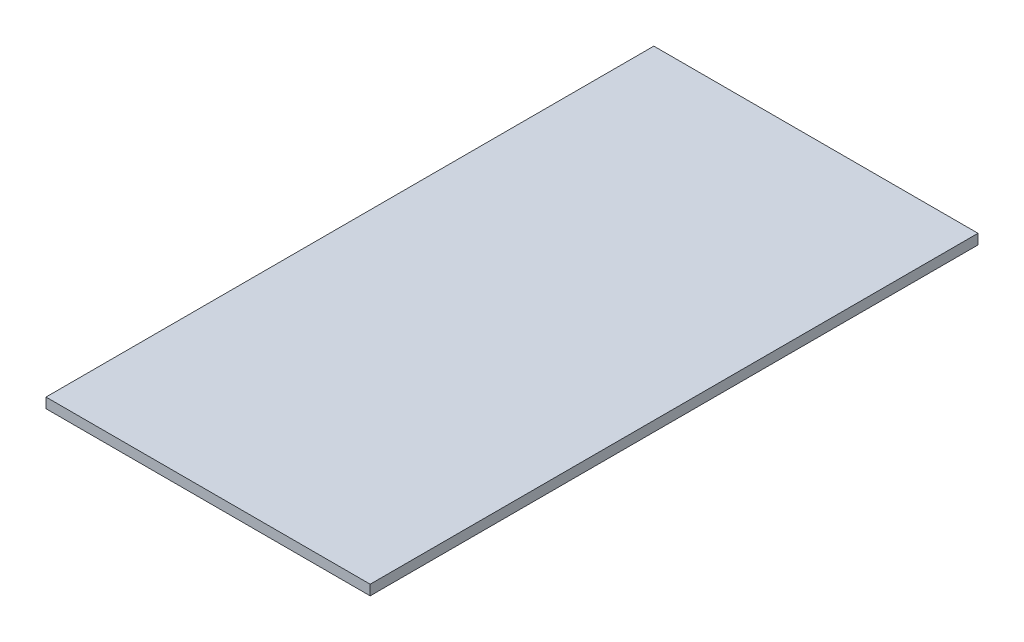
ISO-10303-21;
HEADER;
FILE_DESCRIPTION(('STEP AP214'),'2;1');
FILE_NAME('part.step','',(''),(''),'','','');
FILE_SCHEMA(('AUTOMOTIVE_DESIGN { 1 0 10303 214 1 1 1 1 }'));
ENDSEC;
DATA;
#1=APPLICATION_CONTEXT('core data for automotive mechanical design processes');
#2=APPLICATION_PROTOCOL_DEFINITION('international standard','automotive_design',2000,#1);
#3=PRODUCT_CONTEXT('',#1,'mechanical');
#4=PRODUCT('Part','Part','',(#3));
#5=PRODUCT_RELATED_PRODUCT_CATEGORY('part','',(#4));
#6=PRODUCT_DEFINITION_FORMATION('','',#4);
#7=PRODUCT_DEFINITION_CONTEXT('part definition',#1,'design');
#8=PRODUCT_DEFINITION('design','',#6,#7);
#9=PRODUCT_DEFINITION_SHAPE('','',#8);
#10=(LENGTH_UNIT() NAMED_UNIT(*) SI_UNIT(.MILLI.,.METRE.));
#11=(NAMED_UNIT(*) PLANE_ANGLE_UNIT() SI_UNIT($,.RADIAN.));
#12=(NAMED_UNIT(*) SI_UNIT($,.STERADIAN.) SOLID_ANGLE_UNIT());
#13=UNCERTAINTY_MEASURE_WITH_UNIT(LENGTH_MEASURE(1.E-05),#10,'distance_accuracy_value','');
#14=(GEOMETRIC_REPRESENTATION_CONTEXT(3) GLOBAL_UNCERTAINTY_ASSIGNED_CONTEXT((#13)) GLOBAL_UNIT_ASSIGNED_CONTEXT((#10,
#11,#12)) REPRESENTATION_CONTEXT('',''));
#15=CARTESIAN_POINT('',(0.,0.,0.));
#16=DIRECTION('',(0.,0.,1.));
#17=DIRECTION('',(1.,0.,0.));
#18=AXIS2_PLACEMENT_3D('',#15,#16,#17);
#19=CARTESIAN_POINT('',(48.,3.,90.));
#20=DIRECTION('',(-1.,0.,0.));
#21=DIRECTION('',(0.,0.,1.));
#22=AXIS2_PLACEMENT_3D('',#19,#20,#21);
#23=PLANE('',#22);
#24=DIRECTION('',(0.,0.,-1.));
#25=VECTOR('',#24,1.);
#26=CARTESIAN_POINT('',(48.,0.,90.));
#27=LINE('',#26,#25);
#28=CARTESIAN_POINT('',(48.,0.,90.));
#29=VERTEX_POINT('',#28);
#30=CARTESIAN_POINT('',(48.,0.,-90.));
#31=VERTEX_POINT('',#30);
#32=EDGE_CURVE('E96',#29,#31,#27,.T.);
#33=ORIENTED_EDGE('',*,*,#32,.T.);
#34=DIRECTION('',(0.,-1.,0.));
#35=VECTOR('',#34,1.);
#36=CARTESIAN_POINT('',(48.,3.,-90.));
#37=LINE('',#36,#35);
#38=CARTESIAN_POINT('',(48.,3.,-90.));
#39=VERTEX_POINT('',#38);
#40=EDGE_CURVE('E11',#39,#31,#37,.T.);
#41=ORIENTED_EDGE('',*,*,#40,.F.);
#42=DIRECTION('',(0.,0.,-1.));
#43=VECTOR('',#42,1.);
#44=CARTESIAN_POINT('',(48.,3.,90.));
#45=LINE('',#44,#43);
#46=CARTESIAN_POINT('',(48.,3.,90.));
#47=VERTEX_POINT('',#46);
#48=EDGE_CURVE('E84',#47,#39,#45,.T.);
#49=ORIENTED_EDGE('',*,*,#48,.F.);
#50=DIRECTION('',(0.,-1.,0.));
#51=VECTOR('',#50,1.);
#52=CARTESIAN_POINT('',(48.,3.,90.));
#53=LINE('',#52,#51);
#54=EDGE_CURVE('E92',#47,#29,#53,.T.);
#55=ORIENTED_EDGE('',*,*,#54,.T.);
#56=EDGE_LOOP('',(#33,#41,#49,#55));
#57=FACE_BOUND('',#56,.T.);
#58=ADVANCED_FACE('F33',(#57),#23,.F.);
#59=CARTESIAN_POINT('',(-48.,3.,-90.));
#60=DIRECTION('',(0.,0.,1.));
#61=DIRECTION('',(1.,0.,0.));
#62=AXIS2_PLACEMENT_3D('',#59,#60,#61);
#63=PLANE('',#62);
#64=DIRECTION('',(-1.,0.,0.));
#65=VECTOR('',#64,1.);
#66=CARTESIAN_POINT('',(-48.,0.,-90.));
#67=LINE('',#66,#65);
#68=CARTESIAN_POINT('',(-48.,0.,-90.));
#69=VERTEX_POINT('',#68);
#70=EDGE_CURVE('E88',#31,#69,#67,.T.);
#71=ORIENTED_EDGE('',*,*,#70,.T.);
#72=DIRECTION('',(0.,-1.,0.));
#73=VECTOR('',#72,1.);
#74=CARTESIAN_POINT('',(-48.,3.,-90.));
#75=LINE('',#74,#73);
#76=CARTESIAN_POINT('',(-48.,3.,-90.));
#77=VERTEX_POINT('',#76);
#78=EDGE_CURVE('E41',#77,#69,#75,.T.);
#79=ORIENTED_EDGE('',*,*,#78,.F.);
#80=DIRECTION('',(-1.,0.,0.));
#81=VECTOR('',#80,1.);
#82=CARTESIAN_POINT('',(-48.,3.,-90.));
#83=LINE('',#82,#81);
#84=EDGE_CURVE('E79',#39,#77,#83,.T.);
#85=ORIENTED_EDGE('',*,*,#84,.F.);
#86=ORIENTED_EDGE('',*,*,#40,.T.);
#87=EDGE_LOOP('',(#71,#79,#85,#86));
#88=FACE_BOUND('',#87,.T.);
#89=ADVANCED_FACE('F87',(#88),#63,.F.);
#90=CARTESIAN_POINT('',(-48.,3.,90.));
#91=DIRECTION('',(1.,0.,0.));
#92=DIRECTION('',(0.,0.,-1.));
#93=AXIS2_PLACEMENT_3D('',#90,#91,#92);
#94=PLANE('',#93);
#95=DIRECTION('',(0.,0.,1.));
#96=VECTOR('',#95,1.);
#97=CARTESIAN_POINT('',(-48.,0.,90.));
#98=LINE('',#97,#96);
#99=CARTESIAN_POINT('',(-48.,0.,90.));
#100=VERTEX_POINT('',#99);
#101=EDGE_CURVE('E66',#69,#100,#98,.T.);
#102=ORIENTED_EDGE('',*,*,#101,.T.);
#103=DIRECTION('',(0.,-1.,0.));
#104=VECTOR('',#103,1.);
#105=CARTESIAN_POINT('',(-48.,3.,90.));
#106=LINE('',#105,#104);
#107=CARTESIAN_POINT('',(-48.,3.,90.));
#108=VERTEX_POINT('',#107);
#109=EDGE_CURVE('E89',#108,#100,#106,.T.);
#110=ORIENTED_EDGE('',*,*,#109,.F.);
#111=DIRECTION('',(0.,0.,1.));
#112=VECTOR('',#111,1.);
#113=CARTESIAN_POINT('',(-48.,3.,90.));
#114=LINE('',#113,#112);
#115=EDGE_CURVE('E82',#77,#108,#114,.T.);
#116=ORIENTED_EDGE('',*,*,#115,.F.);
#117=ORIENTED_EDGE('',*,*,#78,.T.);
#118=EDGE_LOOP('',(#102,#110,#116,#117));
#119=FACE_BOUND('',#118,.T.);
#120=ADVANCED_FACE('F90',(#119),#94,.F.);
#121=CARTESIAN_POINT('',(-48.,3.,90.));
#122=DIRECTION('',(0.,0.,-1.));
#123=DIRECTION('',(-1.,0.,0.));
#124=AXIS2_PLACEMENT_3D('',#121,#122,#123);
#125=PLANE('',#124);
#126=DIRECTION('',(1.,0.,0.));
#127=VECTOR('',#126,1.);
#128=CARTESIAN_POINT('',(-48.,0.,90.));
#129=LINE('',#128,#127);
#130=EDGE_CURVE('E72',#100,#29,#129,.T.);
#131=ORIENTED_EDGE('',*,*,#130,.T.);
#132=ORIENTED_EDGE('',*,*,#54,.F.);
#133=DIRECTION('',(1.,0.,0.));
#134=VECTOR('',#133,1.);
#135=CARTESIAN_POINT('',(-48.,3.,90.));
#136=LINE('',#135,#134);
#137=EDGE_CURVE('E49',#108,#47,#136,.T.);
#138=ORIENTED_EDGE('',*,*,#137,.F.);
#139=ORIENTED_EDGE('',*,*,#109,.T.);
#140=EDGE_LOOP('',(#131,#132,#138,#139));
#141=FACE_BOUND('',#140,.T.);
#142=ADVANCED_FACE('F103',(#141),#125,.F.);
#143=CARTESIAN_POINT('',(0.,3.,0.));
#144=DIRECTION('',(0.,-1.,0.));
#145=DIRECTION('',(0.,0.,-1.));
#146=AXIS2_PLACEMENT_3D('',#143,#144,#145);
#147=PLANE('',#146);
#148=ORIENTED_EDGE('',*,*,#48,.T.);
#149=ORIENTED_EDGE('',*,*,#84,.T.);
#150=ORIENTED_EDGE('',*,*,#115,.T.);
#151=ORIENTED_EDGE('',*,*,#137,.T.);
#152=EDGE_LOOP('',(#148,#149,#150,#151));
#153=FACE_BOUND('',#152,.T.);
#154=ADVANCED_FACE('F80',(#153),#147,.F.);
#155=CARTESIAN_POINT('',(0.,0.,0.));
#156=DIRECTION('',(0.,-1.,0.));
#157=DIRECTION('',(0.,0.,-1.));
#158=AXIS2_PLACEMENT_3D('',#155,#156,#157);
#159=PLANE('',#158);
#160=ORIENTED_EDGE('',*,*,#32,.F.);
#161=ORIENTED_EDGE('',*,*,#130,.F.);
#162=ORIENTED_EDGE('',*,*,#101,.F.);
#163=ORIENTED_EDGE('',*,*,#70,.F.);
#164=EDGE_LOOP('',(#160,#161,#162,#163));
#165=FACE_BOUND('',#164,.T.);
#166=ADVANCED_FACE('F106',(#165),#159,.T.);
#167=CLOSED_SHELL('',(#58,#89,#120,#142,#154,#166));
#168=MANIFOLD_SOLID_BREP('B2',#167);
#169=ADVANCED_BREP_SHAPE_REPRESENTATION('',(#18,#168),#14);
#170=SHAPE_DEFINITION_REPRESENTATION(#9,#169);
ENDSEC;
END-ISO-10303-21;
